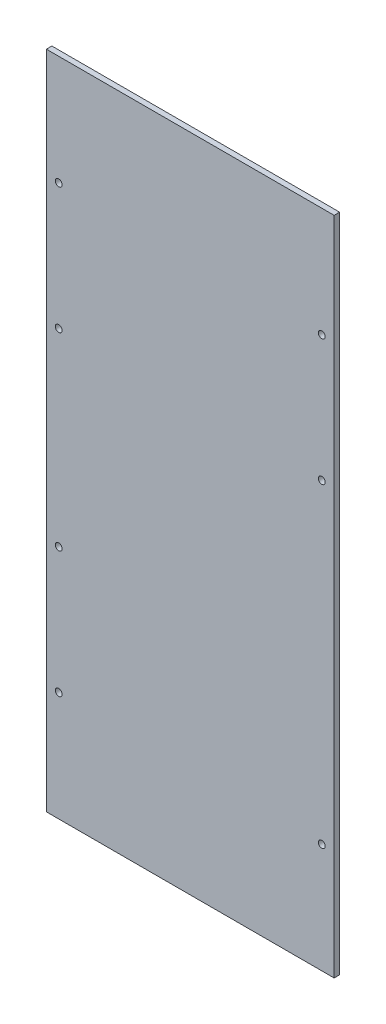
ISO-10303-21;
HEADER;
FILE_DESCRIPTION(('STEP AP214'),'2;1');
FILE_NAME('part.step','',(''),(''),'','','');
FILE_SCHEMA(('AUTOMOTIVE_DESIGN { 1 0 10303 214 1 1 1 1 }'));
ENDSEC;
DATA;
#1=APPLICATION_CONTEXT('core data for automotive mechanical design processes');
#2=APPLICATION_PROTOCOL_DEFINITION('international standard','automotive_design',2000,#1);
#3=PRODUCT_CONTEXT('',#1,'mechanical');
#4=PRODUCT('Part','Part','',(#3));
#5=PRODUCT_RELATED_PRODUCT_CATEGORY('part','',(#4));
#6=PRODUCT_DEFINITION_FORMATION('','',#4);
#7=PRODUCT_DEFINITION_CONTEXT('part definition',#1,'design');
#8=PRODUCT_DEFINITION('design','',#6,#7);
#9=PRODUCT_DEFINITION_SHAPE('','',#8);
#10=(LENGTH_UNIT() NAMED_UNIT(*) SI_UNIT(.MILLI.,.METRE.));
#11=(NAMED_UNIT(*) PLANE_ANGLE_UNIT() SI_UNIT($,.RADIAN.));
#12=(NAMED_UNIT(*) SI_UNIT($,.STERADIAN.) SOLID_ANGLE_UNIT());
#13=UNCERTAINTY_MEASURE_WITH_UNIT(LENGTH_MEASURE(1.E-05),#10,'distance_accuracy_value','');
#14=(GEOMETRIC_REPRESENTATION_CONTEXT(3) GLOBAL_UNCERTAINTY_ASSIGNED_CONTEXT((#13)) GLOBAL_UNIT_ASSIGNED_CONTEXT((#10,
#11,#12)) REPRESENTATION_CONTEXT('',''));
#15=CARTESIAN_POINT('',(0.,0.,0.));
#16=DIRECTION('',(0.,0.,1.));
#17=DIRECTION('',(1.,0.,0.));
#18=AXIS2_PLACEMENT_3D('',#15,#16,#17);
#19=CARTESIAN_POINT('',(0.,0.,4.));
#20=DIRECTION('',(0.,0.,-1.));
#21=DIRECTION('',(-1.,0.,0.));
#22=AXIS2_PLACEMENT_3D('',#19,#20,#21);
#23=PLANE('',#22);
#24=DIRECTION('',(0.,-1.,0.));
#25=VECTOR('',#24,1.);
#26=CARTESIAN_POINT('',(-90.5016149039087,703.628389677579,4.));
#27=LINE('',#26,#25);
#28=CARTESIAN_POINT('',(-90.5016149039087,1185.62838967758,4.));
#29=VERTEX_POINT('',#28);
#30=CARTESIAN_POINT('',(-90.5016149039087,703.628389677579,4.));
#31=VERTEX_POINT('',#30);
#32=EDGE_CURVE('E85',#29,#31,#27,.T.);
#33=ORIENTED_EDGE('',*,*,#32,.T.);
#34=DIRECTION('',(1.,0.,0.));
#35=VECTOR('',#34,1.);
#36=CARTESIAN_POINT('',(-90.5016149039087,703.628389677579,4.));
#37=LINE('',#36,#35);
#38=CARTESIAN_POINT('',(119.498385096091,703.628389677579,4.));
#39=VERTEX_POINT('',#38);
#40=EDGE_CURVE('E80',#31,#39,#37,.T.);
#41=ORIENTED_EDGE('',*,*,#40,.T.);
#42=DIRECTION('',(0.,1.,0.));
#43=VECTOR('',#42,1.);
#44=CARTESIAN_POINT('',(119.498385096091,703.628389677579,4.));
#45=LINE('',#44,#43);
#46=CARTESIAN_POINT('',(119.498385096091,1185.62838967758,4.));
#47=VERTEX_POINT('',#46);
#48=EDGE_CURVE('E83',#39,#47,#45,.T.);
#49=ORIENTED_EDGE('',*,*,#48,.T.);
#50=DIRECTION('',(-1.,0.,0.));
#51=VECTOR('',#50,1.);
#52=CARTESIAN_POINT('',(-90.5016149039087,1185.62838967758,4.));
#53=LINE('',#52,#51);
#54=EDGE_CURVE('E50',#47,#29,#53,.T.);
#55=ORIENTED_EDGE('',*,*,#54,.T.);
#56=EDGE_LOOP('',(#33,#41,#49,#55));
#57=FACE_BOUND('',#56,.T.);
#58=CARTESIAN_POINT('',(110.498385096091,1105.63838967758,4.));
#59=DIRECTION('',(0.,0.,1.));
#60=DIRECTION('',(1.,0.,0.));
#61=AXIS2_PLACEMENT_3D('',#58,#59,#60);
#62=CIRCLE('',#61,2.49999999999996);
#63=CARTESIAN_POINT('',(112.998385096091,1105.63838967758,4.));
#64=VERTEX_POINT('',#63);
#65=EDGE_CURVE('E100',#64,#64,#62,.T.);
#66=ORIENTED_EDGE('',*,*,#65,.F.);
#67=EDGE_LOOP('',(#66));
#68=FACE_BOUND('',#67,.T.);
#69=CARTESIAN_POINT('',(-81.5016149039087,1105.63838967758,4.));
#70=DIRECTION('',(0.,0.,1.));
#71=DIRECTION('',(1.,0.,0.));
#72=AXIS2_PLACEMENT_3D('',#69,#70,#71);
#73=CIRCLE('',#72,2.50000000000004);
#74=CARTESIAN_POINT('',(-79.0016149039087,1105.63838967758,4.));
#75=VERTEX_POINT('',#74);
#76=EDGE_CURVE('E115',#75,#75,#73,.T.);
#77=ORIENTED_EDGE('',*,*,#76,.F.);
#78=EDGE_LOOP('',(#77));
#79=FACE_BOUND('',#78,.T.);
#80=CARTESIAN_POINT('',(-81.5016149039087,1013.63838967758,4.));
#81=DIRECTION('',(0.,0.,1.));
#82=DIRECTION('',(1.,0.,0.));
#83=AXIS2_PLACEMENT_3D('',#80,#81,#82);
#84=CIRCLE('',#83,2.49999999999991);
#85=CARTESIAN_POINT('',(-79.0016149039088,1013.63838967758,4.));
#86=VERTEX_POINT('',#85);
#87=EDGE_CURVE('E121',#86,#86,#84,.T.);
#88=ORIENTED_EDGE('',*,*,#87,.F.);
#89=EDGE_LOOP('',(#88));
#90=FACE_BOUND('',#89,.T.);
#91=CARTESIAN_POINT('',(110.498385096091,1013.63838967758,4.));
#92=DIRECTION('',(0.,0.,1.));
#93=DIRECTION('',(1.,0.,0.));
#94=AXIS2_PLACEMENT_3D('',#91,#92,#93);
#95=CIRCLE('',#94,2.50000000000021);
#96=CARTESIAN_POINT('',(112.998385096092,1013.63838967758,4.));
#97=VERTEX_POINT('',#96);
#98=EDGE_CURVE('E127',#97,#97,#95,.T.);
#99=ORIENTED_EDGE('',*,*,#98,.F.);
#100=EDGE_LOOP('',(#99));
#101=FACE_BOUND('',#100,.T.);
#102=CARTESIAN_POINT('',(-81.5016149039087,875.618389677579,4.));
#103=DIRECTION('',(0.,0.,1.));
#104=DIRECTION('',(1.,0.,0.));
#105=AXIS2_PLACEMENT_3D('',#102,#103,#104);
#106=CIRCLE('',#105,2.49999999999992);
#107=CARTESIAN_POINT('',(-79.0016149039088,875.618389677579,4.));
#108=VERTEX_POINT('',#107);
#109=EDGE_CURVE('E133',#108,#108,#106,.T.);
#110=ORIENTED_EDGE('',*,*,#109,.F.);
#111=EDGE_LOOP('',(#110));
#112=FACE_BOUND('',#111,.T.);
#113=CARTESIAN_POINT('',(110.498385096091,783.618389677579,4.));
#114=DIRECTION('',(0.,0.,1.));
#115=DIRECTION('',(1.,0.,0.));
#116=AXIS2_PLACEMENT_3D('',#113,#114,#115);
#117=CIRCLE('',#116,2.49999999999998);
#118=CARTESIAN_POINT('',(112.998385096091,783.618389677579,4.));
#119=VERTEX_POINT('',#118);
#120=EDGE_CURVE('E139',#119,#119,#117,.T.);
#121=ORIENTED_EDGE('',*,*,#120,.F.);
#122=EDGE_LOOP('',(#121));
#123=FACE_BOUND('',#122,.T.);
#124=CARTESIAN_POINT('',(-81.5016149039087,783.618389677579,4.));
#125=DIRECTION('',(0.,0.,1.));
#126=DIRECTION('',(1.,0.,0.));
#127=AXIS2_PLACEMENT_3D('',#124,#125,#126);
#128=CIRCLE('',#127,2.50000000000006);
#129=CARTESIAN_POINT('',(-79.0016149039087,783.618389677579,4.));
#130=VERTEX_POINT('',#129);
#131=EDGE_CURVE('E145',#130,#130,#128,.T.);
#132=ORIENTED_EDGE('',*,*,#131,.F.);
#133=EDGE_LOOP('',(#132));
#134=FACE_BOUND('',#133,.T.);
#135=ADVANCED_FACE('F33',(#57,#68,#79,#90,#101,#112,#123,#134),#23,.F.);
#136=CARTESIAN_POINT('',(0.,0.,0.));
#137=DIRECTION('',(0.,0.,-1.));
#138=DIRECTION('',(-1.,0.,0.));
#139=AXIS2_PLACEMENT_3D('',#136,#137,#138);
#140=PLANE('',#139);
#141=CARTESIAN_POINT('',(110.498385096091,783.618389677579,0.));
#142=DIRECTION('',(0.,0.,1.));
#143=DIRECTION('',(1.,0.,0.));
#144=AXIS2_PLACEMENT_3D('',#141,#142,#143);
#145=CIRCLE('',#144,2.49999999999998);
#146=CARTESIAN_POINT('',(112.998385096091,783.618389677579,0.));
#147=VERTEX_POINT('',#146);
#148=EDGE_CURVE('E142',#147,#147,#145,.T.);
#149=ORIENTED_EDGE('',*,*,#148,.T.);
#150=EDGE_LOOP('',(#149));
#151=FACE_BOUND('',#150,.T.);
#152=CARTESIAN_POINT('',(110.498385096091,1013.63838967758,0.));
#153=DIRECTION('',(0.,0.,1.));
#154=DIRECTION('',(1.,0.,0.));
#155=AXIS2_PLACEMENT_3D('',#152,#153,#154);
#156=CIRCLE('',#155,2.50000000000021);
#157=CARTESIAN_POINT('',(112.998385096092,1013.63838967758,0.));
#158=VERTEX_POINT('',#157);
#159=EDGE_CURVE('E130',#158,#158,#156,.T.);
#160=ORIENTED_EDGE('',*,*,#159,.T.);
#161=EDGE_LOOP('',(#160));
#162=FACE_BOUND('',#161,.T.);
#163=CARTESIAN_POINT('',(-81.5016149039087,1105.63838967758,0.));
#164=DIRECTION('',(0.,0.,1.));
#165=DIRECTION('',(1.,0.,0.));
#166=AXIS2_PLACEMENT_3D('',#163,#164,#165);
#167=CIRCLE('',#166,2.50000000000004);
#168=CARTESIAN_POINT('',(-79.0016149039087,1105.63838967758,0.));
#169=VERTEX_POINT('',#168);
#170=EDGE_CURVE('E118',#169,#169,#167,.T.);
#171=ORIENTED_EDGE('',*,*,#170,.T.);
#172=EDGE_LOOP('',(#171));
#173=FACE_BOUND('',#172,.T.);
#174=DIRECTION('',(0.,-1.,0.));
#175=VECTOR('',#174,1.);
#176=CARTESIAN_POINT('',(-90.5016149039087,703.628389677579,0.));
#177=LINE('',#176,#175);
#178=CARTESIAN_POINT('',(-90.5016149039087,1185.62838967758,0.));
#179=VERTEX_POINT('',#178);
#180=CARTESIAN_POINT('',(-90.5016149039087,703.628389677579,0.));
#181=VERTEX_POINT('',#180);
#182=EDGE_CURVE('E97',#179,#181,#177,.T.);
#183=ORIENTED_EDGE('',*,*,#182,.F.);
#184=DIRECTION('',(-1.,0.,0.));
#185=VECTOR('',#184,1.);
#186=CARTESIAN_POINT('',(-90.5016149039087,1185.62838967758,0.));
#187=LINE('',#186,#185);
#188=CARTESIAN_POINT('',(119.498385096091,1185.62838967758,0.));
#189=VERTEX_POINT('',#188);
#190=EDGE_CURVE('E73',#189,#179,#187,.T.);
#191=ORIENTED_EDGE('',*,*,#190,.F.);
#192=DIRECTION('',(0.,1.,0.));
#193=VECTOR('',#192,1.);
#194=CARTESIAN_POINT('',(119.498385096091,703.628389677579,0.));
#195=LINE('',#194,#193);
#196=CARTESIAN_POINT('',(119.498385096091,703.628389677579,0.));
#197=VERTEX_POINT('',#196);
#198=EDGE_CURVE('E67',#197,#189,#195,.T.);
#199=ORIENTED_EDGE('',*,*,#198,.F.);
#200=DIRECTION('',(1.,0.,0.));
#201=VECTOR('',#200,1.);
#202=CARTESIAN_POINT('',(-90.5016149039087,703.628389677579,0.));
#203=LINE('',#202,#201);
#204=EDGE_CURVE('E89',#181,#197,#203,.T.);
#205=ORIENTED_EDGE('',*,*,#204,.F.);
#206=EDGE_LOOP('',(#183,#191,#199,#205));
#207=FACE_BOUND('',#206,.T.);
#208=CARTESIAN_POINT('',(110.498385096091,1105.63838967758,0.));
#209=DIRECTION('',(0.,0.,1.));
#210=DIRECTION('',(1.,0.,0.));
#211=AXIS2_PLACEMENT_3D('',#208,#209,#210);
#212=CIRCLE('',#211,2.49999999999996);
#213=CARTESIAN_POINT('',(112.998385096091,1105.63838967758,0.));
#214=VERTEX_POINT('',#213);
#215=EDGE_CURVE('E112',#214,#214,#212,.T.);
#216=ORIENTED_EDGE('',*,*,#215,.T.);
#217=EDGE_LOOP('',(#216));
#218=FACE_BOUND('',#217,.T.);
#219=CARTESIAN_POINT('',(-81.5016149039087,1013.63838967758,0.));
#220=DIRECTION('',(0.,0.,1.));
#221=DIRECTION('',(1.,0.,0.));
#222=AXIS2_PLACEMENT_3D('',#219,#220,#221);
#223=CIRCLE('',#222,2.49999999999991);
#224=CARTESIAN_POINT('',(-79.0016149039088,1013.63838967758,0.));
#225=VERTEX_POINT('',#224);
#226=EDGE_CURVE('E124',#225,#225,#223,.T.);
#227=ORIENTED_EDGE('',*,*,#226,.T.);
#228=EDGE_LOOP('',(#227));
#229=FACE_BOUND('',#228,.T.);
#230=CARTESIAN_POINT('',(-81.5016149039087,875.618389677579,0.));
#231=DIRECTION('',(0.,0.,1.));
#232=DIRECTION('',(1.,0.,0.));
#233=AXIS2_PLACEMENT_3D('',#230,#231,#232);
#234=CIRCLE('',#233,2.49999999999992);
#235=CARTESIAN_POINT('',(-79.0016149039088,875.618389677579,0.));
#236=VERTEX_POINT('',#235);
#237=EDGE_CURVE('E136',#236,#236,#234,.T.);
#238=ORIENTED_EDGE('',*,*,#237,.T.);
#239=EDGE_LOOP('',(#238));
#240=FACE_BOUND('',#239,.T.);
#241=CARTESIAN_POINT('',(-81.5016149039087,783.618389677579,0.));
#242=DIRECTION('',(0.,0.,1.));
#243=DIRECTION('',(1.,0.,0.));
#244=AXIS2_PLACEMENT_3D('',#241,#242,#243);
#245=CIRCLE('',#244,2.50000000000006);
#246=CARTESIAN_POINT('',(-79.0016149039087,783.618389677579,0.));
#247=VERTEX_POINT('',#246);
#248=EDGE_CURVE('E148',#247,#247,#245,.T.);
#249=ORIENTED_EDGE('',*,*,#248,.T.);
#250=EDGE_LOOP('',(#249));
#251=FACE_BOUND('',#250,.T.);
#252=ADVANCED_FACE('F108',(#151,#162,#173,#207,#218,#229,#240,#251),#140,.T.);
#253=CARTESIAN_POINT('',(-90.5016149039087,703.628389677579,4.));
#254=DIRECTION('',(1.,0.,0.));
#255=DIRECTION('',(0.,0.,-1.));
#256=AXIS2_PLACEMENT_3D('',#253,#254,#255);
#257=PLANE('',#256);
#258=ORIENTED_EDGE('',*,*,#182,.T.);
#259=DIRECTION('',(0.,0.,-1.));
#260=VECTOR('',#259,1.);
#261=CARTESIAN_POINT('',(-90.5016149039087,703.628389677579,4.));
#262=LINE('',#261,#260);
#263=EDGE_CURVE('E11',#31,#181,#262,.T.);
#264=ORIENTED_EDGE('',*,*,#263,.F.);
#265=ORIENTED_EDGE('',*,*,#32,.F.);
#266=DIRECTION('',(0.,0.,-1.));
#267=VECTOR('',#266,1.);
#268=CARTESIAN_POINT('',(-90.5016149039087,1185.62838967758,4.));
#269=LINE('',#268,#267);
#270=EDGE_CURVE('E93',#29,#179,#269,.T.);
#271=ORIENTED_EDGE('',*,*,#270,.T.);
#272=EDGE_LOOP('',(#258,#264,#265,#271));
#273=FACE_BOUND('',#272,.T.);
#274=ADVANCED_FACE('F35',(#273),#257,.F.);
#275=CARTESIAN_POINT('',(-90.5016149039087,703.628389677579,4.));
#276=DIRECTION('',(0.,1.,0.));
#277=DIRECTION('',(0.,0.,1.));
#278=AXIS2_PLACEMENT_3D('',#275,#276,#277);
#279=PLANE('',#278);
#280=ORIENTED_EDGE('',*,*,#204,.T.);
#281=DIRECTION('',(0.,0.,-1.));
#282=VECTOR('',#281,1.);
#283=CARTESIAN_POINT('',(119.498385096091,703.628389677579,4.));
#284=LINE('',#283,#282);
#285=EDGE_CURVE('E42',#39,#197,#284,.T.);
#286=ORIENTED_EDGE('',*,*,#285,.F.);
#287=ORIENTED_EDGE('',*,*,#40,.F.);
#288=ORIENTED_EDGE('',*,*,#263,.T.);
#289=EDGE_LOOP('',(#280,#286,#287,#288));
#290=FACE_BOUND('',#289,.T.);
#291=ADVANCED_FACE('F88',(#290),#279,.F.);
#292=CARTESIAN_POINT('',(119.498385096091,703.628389677579,4.));
#293=DIRECTION('',(-1.,0.,0.));
#294=DIRECTION('',(0.,0.,1.));
#295=AXIS2_PLACEMENT_3D('',#292,#293,#294);
#296=PLANE('',#295);
#297=ORIENTED_EDGE('',*,*,#198,.T.);
#298=DIRECTION('',(0.,0.,-1.));
#299=VECTOR('',#298,1.);
#300=CARTESIAN_POINT('',(119.498385096091,1185.62838967758,4.));
#301=LINE('',#300,#299);
#302=EDGE_CURVE('E90',#47,#189,#301,.T.);
#303=ORIENTED_EDGE('',*,*,#302,.F.);
#304=ORIENTED_EDGE('',*,*,#48,.F.);
#305=ORIENTED_EDGE('',*,*,#285,.T.);
#306=EDGE_LOOP('',(#297,#303,#304,#305));
#307=FACE_BOUND('',#306,.T.);
#308=ADVANCED_FACE('F91',(#307),#296,.F.);
#309=CARTESIAN_POINT('',(-90.5016149039087,1185.62838967758,4.));
#310=DIRECTION('',(0.,-1.,0.));
#311=DIRECTION('',(0.,0.,-1.));
#312=AXIS2_PLACEMENT_3D('',#309,#310,#311);
#313=PLANE('',#312);
#314=ORIENTED_EDGE('',*,*,#190,.T.);
#315=ORIENTED_EDGE('',*,*,#270,.F.);
#316=ORIENTED_EDGE('',*,*,#54,.F.);
#317=ORIENTED_EDGE('',*,*,#302,.T.);
#318=EDGE_LOOP('',(#314,#315,#316,#317));
#319=FACE_BOUND('',#318,.T.);
#320=ADVANCED_FACE('F105',(#319),#313,.F.);
#321=CARTESIAN_POINT('',(110.498385096091,1105.63838967758,4.));
#322=DIRECTION('',(0.,0.,-1.));
#323=DIRECTION('',(-1.,0.,0.));
#324=AXIS2_PLACEMENT_3D('',#321,#322,#323);
#325=CYLINDRICAL_SURFACE('',#324,2.49999999999996);
#326=ORIENTED_EDGE('',*,*,#65,.T.);
#327=EDGE_LOOP('',(#326));
#328=FACE_BOUND('',#327,.T.);
#329=ORIENTED_EDGE('',*,*,#215,.F.);
#330=EDGE_LOOP('',(#329));
#331=FACE_BOUND('',#330,.T.);
#332=ADVANCED_FACE('F165',(#328,#331),#325,.F.);
#333=CARTESIAN_POINT('',(-81.5016149039087,1105.63838967758,4.));
#334=DIRECTION('',(0.,0.,-1.));
#335=DIRECTION('',(-1.,0.,0.));
#336=AXIS2_PLACEMENT_3D('',#333,#334,#335);
#337=CYLINDRICAL_SURFACE('',#336,2.50000000000004);
#338=ORIENTED_EDGE('',*,*,#76,.T.);
#339=EDGE_LOOP('',(#338));
#340=FACE_BOUND('',#339,.T.);
#341=ORIENTED_EDGE('',*,*,#170,.F.);
#342=EDGE_LOOP('',(#341));
#343=FACE_BOUND('',#342,.T.);
#344=ADVANCED_FACE('F211',(#340,#343),#337,.F.);
#345=CARTESIAN_POINT('',(-81.5016149039087,1013.63838967758,4.));
#346=DIRECTION('',(0.,0.,-1.));
#347=DIRECTION('',(-1.,0.,0.));
#348=AXIS2_PLACEMENT_3D('',#345,#346,#347);
#349=CYLINDRICAL_SURFACE('',#348,2.49999999999991);
#350=ORIENTED_EDGE('',*,*,#87,.T.);
#351=EDGE_LOOP('',(#350));
#352=FACE_BOUND('',#351,.T.);
#353=ORIENTED_EDGE('',*,*,#226,.F.);
#354=EDGE_LOOP('',(#353));
#355=FACE_BOUND('',#354,.T.);
#356=ADVANCED_FACE('F219',(#352,#355),#349,.F.);
#357=CARTESIAN_POINT('',(110.498385096091,1013.63838967758,4.));
#358=DIRECTION('',(0.,0.,-1.));
#359=DIRECTION('',(-1.,0.,0.));
#360=AXIS2_PLACEMENT_3D('',#357,#358,#359);
#361=CYLINDRICAL_SURFACE('',#360,2.50000000000021);
#362=ORIENTED_EDGE('',*,*,#98,.T.);
#363=EDGE_LOOP('',(#362));
#364=FACE_BOUND('',#363,.T.);
#365=ORIENTED_EDGE('',*,*,#159,.F.);
#366=EDGE_LOOP('',(#365));
#367=FACE_BOUND('',#366,.T.);
#368=ADVANCED_FACE('F227',(#364,#367),#361,.F.);
#369=CARTESIAN_POINT('',(-81.5016149039087,875.618389677579,4.));
#370=DIRECTION('',(0.,0.,-1.));
#371=DIRECTION('',(-1.,0.,0.));
#372=AXIS2_PLACEMENT_3D('',#369,#370,#371);
#373=CYLINDRICAL_SURFACE('',#372,2.49999999999992);
#374=ORIENTED_EDGE('',*,*,#109,.T.);
#375=EDGE_LOOP('',(#374));
#376=FACE_BOUND('',#375,.T.);
#377=ORIENTED_EDGE('',*,*,#237,.F.);
#378=EDGE_LOOP('',(#377));
#379=FACE_BOUND('',#378,.T.);
#380=ADVANCED_FACE('F236',(#376,#379),#373,.F.);
#381=CARTESIAN_POINT('',(110.498385096091,783.618389677579,4.));
#382=DIRECTION('',(0.,0.,-1.));
#383=DIRECTION('',(-1.,0.,0.));
#384=AXIS2_PLACEMENT_3D('',#381,#382,#383);
#385=CYLINDRICAL_SURFACE('',#384,2.49999999999998);
#386=ORIENTED_EDGE('',*,*,#120,.T.);
#387=EDGE_LOOP('',(#386));
#388=FACE_BOUND('',#387,.T.);
#389=ORIENTED_EDGE('',*,*,#148,.F.);
#390=EDGE_LOOP('',(#389));
#391=FACE_BOUND('',#390,.T.);
#392=ADVANCED_FACE('F245',(#388,#391),#385,.F.);
#393=CARTESIAN_POINT('',(-81.5016149039087,783.618389677579,4.));
#394=DIRECTION('',(0.,0.,-1.));
#395=DIRECTION('',(-1.,0.,0.));
#396=AXIS2_PLACEMENT_3D('',#393,#394,#395);
#397=CYLINDRICAL_SURFACE('',#396,2.50000000000006);
#398=ORIENTED_EDGE('',*,*,#131,.T.);
#399=EDGE_LOOP('',(#398));
#400=FACE_BOUND('',#399,.T.);
#401=ORIENTED_EDGE('',*,*,#248,.F.);
#402=EDGE_LOOP('',(#401));
#403=FACE_BOUND('',#402,.T.);
#404=ADVANCED_FACE('F154',(#400,#403),#397,.F.);
#405=CLOSED_SHELL('',(#135,#252,#274,#291,#308,#320,#332,#344,#356,#368,#380,#392,#404));
#406=MANIFOLD_SOLID_BREP('B2',#405);
#407=ADVANCED_BREP_SHAPE_REPRESENTATION('',(#18,#406),#14);
#408=SHAPE_DEFINITION_REPRESENTATION(#9,#407);
ENDSEC;
END-ISO-10303-21;
